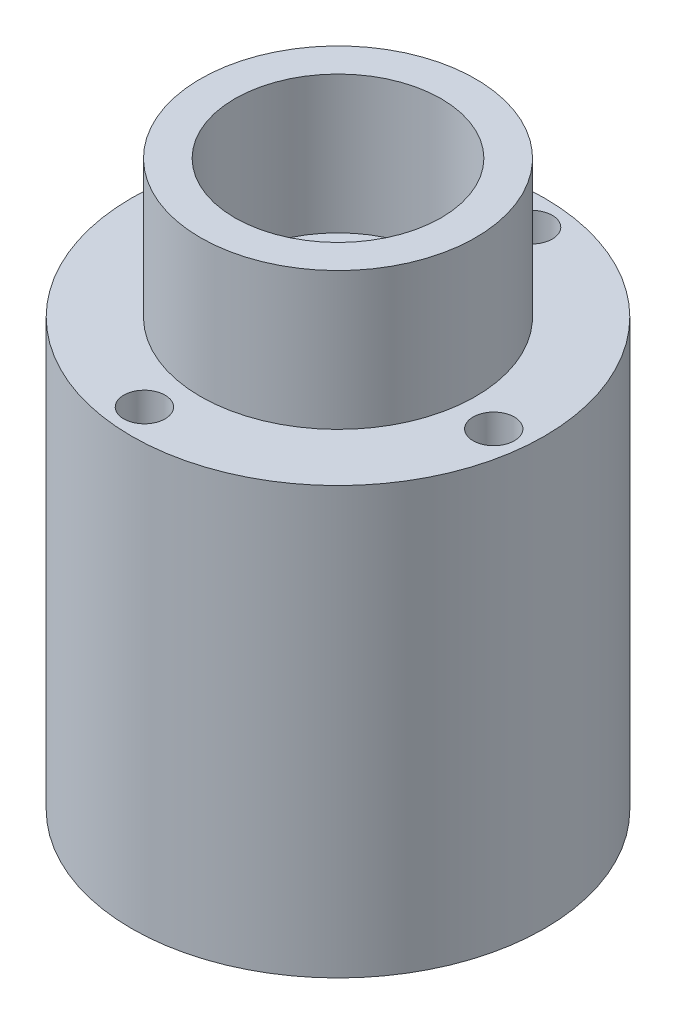
ISO-10303-21;
HEADER;
FILE_DESCRIPTION(('STEP AP214'),'2;1');
FILE_NAME('part.step','',(''),(''),'','','');
FILE_SCHEMA(('AUTOMOTIVE_DESIGN { 1 0 10303 214 1 1 1 1 }'));
ENDSEC;
DATA;
#1=APPLICATION_CONTEXT('core data for automotive mechanical design processes');
#2=APPLICATION_PROTOCOL_DEFINITION('international standard','automotive_design',2000,#1);
#3=PRODUCT_CONTEXT('',#1,'mechanical');
#4=PRODUCT('Part','Part','',(#3));
#5=PRODUCT_RELATED_PRODUCT_CATEGORY('part','',(#4));
#6=PRODUCT_DEFINITION_FORMATION('','',#4);
#7=PRODUCT_DEFINITION_CONTEXT('part definition',#1,'design');
#8=PRODUCT_DEFINITION('design','',#6,#7);
#9=PRODUCT_DEFINITION_SHAPE('','',#8);
#10=(LENGTH_UNIT() NAMED_UNIT(*) SI_UNIT(.MILLI.,.METRE.));
#11=(NAMED_UNIT(*) PLANE_ANGLE_UNIT() SI_UNIT($,.RADIAN.));
#12=(NAMED_UNIT(*) SI_UNIT($,.STERADIAN.) SOLID_ANGLE_UNIT());
#13=UNCERTAINTY_MEASURE_WITH_UNIT(LENGTH_MEASURE(1.E-05),#10,'distance_accuracy_value','');
#14=(GEOMETRIC_REPRESENTATION_CONTEXT(3) GLOBAL_UNCERTAINTY_ASSIGNED_CONTEXT((#13)) GLOBAL_UNIT_ASSIGNED_CONTEXT((#10,
#11,#12)) REPRESENTATION_CONTEXT('',''));
#15=CARTESIAN_POINT('',(0.,0.,0.));
#16=DIRECTION('',(0.,0.,1.));
#17=DIRECTION('',(1.,0.,0.));
#18=AXIS2_PLACEMENT_3D('',#15,#16,#17);
#19=CARTESIAN_POINT('',(0.,31.,0.));
#20=DIRECTION('',(0.,1.,0.));
#21=DIRECTION('',(0.,0.,1.));
#22=AXIS2_PLACEMENT_3D('',#19,#20,#21);
#23=PLANE('',#22);
#24=CARTESIAN_POINT('',(0.,31.,0.));
#25=DIRECTION('',(0.,1.,0.));
#26=DIRECTION('',(0.,0.,1.));
#27=AXIS2_PLACEMENT_3D('',#24,#25,#26);
#28=CIRCLE('',#27,10.);
#29=CARTESIAN_POINT('',(0.,31.,10.));
#30=VERTEX_POINT('',#29);
#31=EDGE_CURVE('E73',#30,#30,#28,.T.);
#32=ORIENTED_EDGE('',*,*,#31,.F.);
#33=EDGE_LOOP('',(#32));
#34=FACE_BOUND('',#33,.T.);
#35=CARTESIAN_POINT('',(12.6976915749806,31.,1.37718271530229));
#36=DIRECTION('',(0.,1.,0.));
#37=DIRECTION('',(0.,0.,1.));
#38=AXIS2_PLACEMENT_3D('',#35,#36,#37);
#39=CIRCLE('',#38,1.5);
#40=CARTESIAN_POINT('',(12.6976915749806,31.,2.87718271530229));
#41=VERTEX_POINT('',#40);
#42=EDGE_CURVE('E58',#41,#41,#39,.T.);
#43=ORIENTED_EDGE('',*,*,#42,.F.);
#44=EDGE_LOOP('',(#43));
#45=FACE_BOUND('',#44,.T.);
#46=CARTESIAN_POINT('',(-12.6976915749806,31.,-1.37718271530229));
#47=DIRECTION('',(0.,1.,0.));
#48=DIRECTION('',(0.,0.,1.));
#49=AXIS2_PLACEMENT_3D('',#46,#47,#48);
#50=CIRCLE('',#49,1.5);
#51=CARTESIAN_POINT('',(-12.6976915749806,31.,0.122817284697706));
#52=VERTEX_POINT('',#51);
#53=EDGE_CURVE('E47',#52,#52,#50,.T.);
#54=ORIENTED_EDGE('',*,*,#53,.F.);
#55=EDGE_LOOP('',(#54));
#56=FACE_BOUND('',#55,.T.);
#57=CARTESIAN_POINT('',(0.,31.,0.));
#58=DIRECTION('',(0.,1.,0.));
#59=DIRECTION('',(0.,0.,1.));
#60=AXIS2_PLACEMENT_3D('',#57,#58,#59);
#61=CIRCLE('',#60,15.);
#62=CARTESIAN_POINT('',(0.,31.,15.));
#63=VERTEX_POINT('',#62);
#64=EDGE_CURVE('E38',#63,#63,#61,.T.);
#65=ORIENTED_EDGE('',*,*,#64,.T.);
#66=EDGE_LOOP('',(#65));
#67=FACE_BOUND('',#66,.T.);
#68=CARTESIAN_POINT('',(1.37718271530229,31.,-12.6976915749806));
#69=DIRECTION('',(0.,1.,0.));
#70=DIRECTION('',(0.,0.,1.));
#71=AXIS2_PLACEMENT_3D('',#68,#69,#70);
#72=CIRCLE('',#71,1.5);
#73=CARTESIAN_POINT('',(1.37718271530229,31.,-11.1976915749806));
#74=VERTEX_POINT('',#73);
#75=EDGE_CURVE('E52',#74,#74,#72,.T.);
#76=ORIENTED_EDGE('',*,*,#75,.F.);
#77=EDGE_LOOP('',(#76));
#78=FACE_BOUND('',#77,.T.);
#79=CARTESIAN_POINT('',(-1.37718271530229,31.,12.6976915749806));
#80=DIRECTION('',(0.,1.,0.));
#81=DIRECTION('',(0.,0.,1.));
#82=AXIS2_PLACEMENT_3D('',#79,#80,#81);
#83=CIRCLE('',#82,1.5);
#84=CARTESIAN_POINT('',(-1.37718271530229,31.,14.1976915749806));
#85=VERTEX_POINT('',#84);
#86=EDGE_CURVE('E64',#85,#85,#83,.T.);
#87=ORIENTED_EDGE('',*,*,#86,.F.);
#88=EDGE_LOOP('',(#87));
#89=FACE_BOUND('',#88,.T.);
#90=ADVANCED_FACE('F31',(#34,#45,#56,#67,#78,#89),#23,.T.);
#91=CARTESIAN_POINT('',(0.,0.,0.));
#92=DIRECTION('',(0.,1.,0.));
#93=DIRECTION('',(0.,0.,1.));
#94=AXIS2_PLACEMENT_3D('',#91,#92,#93);
#95=PLANE('',#94);
#96=CARTESIAN_POINT('',(0.,0.,0.));
#97=DIRECTION('',(0.,1.,0.));
#98=DIRECTION('',(0.,0.,1.));
#99=AXIS2_PLACEMENT_3D('',#96,#97,#98);
#100=CIRCLE('',#99,15.);
#101=CARTESIAN_POINT('',(0.,0.,15.));
#102=VERTEX_POINT('',#101);
#103=EDGE_CURVE('E42',#102,#102,#100,.T.);
#104=ORIENTED_EDGE('',*,*,#103,.F.);
#105=EDGE_LOOP('',(#104));
#106=FACE_BOUND('',#105,.T.);
#107=CARTESIAN_POINT('',(-12.6976915749806,0.,-1.37718271530229));
#108=DIRECTION('',(0.,1.,0.));
#109=DIRECTION('',(0.,0.,1.));
#110=AXIS2_PLACEMENT_3D('',#107,#108,#109);
#111=CIRCLE('',#110,1.5);
#112=CARTESIAN_POINT('',(-12.6976915749806,0.,0.122817284697706));
#113=VERTEX_POINT('',#112);
#114=EDGE_CURVE('E49',#113,#113,#111,.T.);
#115=ORIENTED_EDGE('',*,*,#114,.T.);
#116=EDGE_LOOP('',(#115));
#117=FACE_BOUND('',#116,.T.);
#118=CARTESIAN_POINT('',(1.37718271530229,0.,-12.6976915749806));
#119=DIRECTION('',(0.,1.,0.));
#120=DIRECTION('',(0.,0.,1.));
#121=AXIS2_PLACEMENT_3D('',#118,#119,#120);
#122=CIRCLE('',#121,1.5);
#123=CARTESIAN_POINT('',(1.37718271530229,0.,-11.1976915749806));
#124=VERTEX_POINT('',#123);
#125=EDGE_CURVE('E55',#124,#124,#122,.T.);
#126=ORIENTED_EDGE('',*,*,#125,.T.);
#127=EDGE_LOOP('',(#126));
#128=FACE_BOUND('',#127,.T.);
#129=CARTESIAN_POINT('',(12.6976915749806,0.,1.37718271530229));
#130=DIRECTION('',(0.,1.,0.));
#131=DIRECTION('',(0.,0.,1.));
#132=AXIS2_PLACEMENT_3D('',#129,#130,#131);
#133=CIRCLE('',#132,1.5);
#134=CARTESIAN_POINT('',(12.6976915749806,0.,2.87718271530229));
#135=VERTEX_POINT('',#134);
#136=EDGE_CURVE('E61',#135,#135,#133,.T.);
#137=ORIENTED_EDGE('',*,*,#136,.T.);
#138=EDGE_LOOP('',(#137));
#139=FACE_BOUND('',#138,.T.);
#140=CARTESIAN_POINT('',(-1.37718271530229,0.,12.6976915749806));
#141=DIRECTION('',(0.,1.,0.));
#142=DIRECTION('',(0.,0.,1.));
#143=AXIS2_PLACEMENT_3D('',#140,#141,#142);
#144=CIRCLE('',#143,1.5);
#145=CARTESIAN_POINT('',(-1.37718271530229,0.,14.1976915749806));
#146=VERTEX_POINT('',#145);
#147=EDGE_CURVE('E67',#146,#146,#144,.T.);
#148=ORIENTED_EDGE('',*,*,#147,.T.);
#149=EDGE_LOOP('',(#148));
#150=FACE_BOUND('',#149,.T.);
#151=ADVANCED_FACE('F101',(#106,#117,#128,#139,#150),#95,.F.);
#152=CARTESIAN_POINT('',(0.,31.,0.));
#153=DIRECTION('',(0.,-1.,0.));
#154=DIRECTION('',(0.,0.,-1.));
#155=AXIS2_PLACEMENT_3D('',#152,#153,#154);
#156=CYLINDRICAL_SURFACE('',#155,15.);
#157=ORIENTED_EDGE('',*,*,#64,.F.);
#158=EDGE_LOOP('',(#157));
#159=FACE_BOUND('',#158,.T.);
#160=ORIENTED_EDGE('',*,*,#103,.T.);
#161=EDGE_LOOP('',(#160));
#162=FACE_BOUND('',#161,.T.);
#163=ADVANCED_FACE('F33',(#159,#162),#156,.T.);
#164=CARTESIAN_POINT('',(-12.6976915749806,31.,-1.37718271530229));
#165=DIRECTION('',(0.,-1.,0.));
#166=DIRECTION('',(0.,0.,-1.));
#167=AXIS2_PLACEMENT_3D('',#164,#165,#166);
#168=CYLINDRICAL_SURFACE('',#167,1.5);
#169=ORIENTED_EDGE('',*,*,#53,.T.);
#170=EDGE_LOOP('',(#169));
#171=FACE_BOUND('',#170,.T.);
#172=ORIENTED_EDGE('',*,*,#114,.F.);
#173=EDGE_LOOP('',(#172));
#174=FACE_BOUND('',#173,.T.);
#175=ADVANCED_FACE('F158',(#171,#174),#168,.F.);
#176=CARTESIAN_POINT('',(1.37718271530229,31.,-12.6976915749806));
#177=DIRECTION('',(0.,-1.,0.));
#178=DIRECTION('',(0.,0.,-1.));
#179=AXIS2_PLACEMENT_3D('',#176,#177,#178);
#180=CYLINDRICAL_SURFACE('',#179,1.5);
#181=ORIENTED_EDGE('',*,*,#75,.T.);
#182=EDGE_LOOP('',(#181));
#183=FACE_BOUND('',#182,.T.);
#184=ORIENTED_EDGE('',*,*,#125,.F.);
#185=EDGE_LOOP('',(#184));
#186=FACE_BOUND('',#185,.T.);
#187=ADVANCED_FACE('F148',(#183,#186),#180,.F.);
#188=CARTESIAN_POINT('',(12.6976915749806,31.,1.37718271530229));
#189=DIRECTION('',(0.,-1.,0.));
#190=DIRECTION('',(0.,0.,-1.));
#191=AXIS2_PLACEMENT_3D('',#188,#189,#190);
#192=CYLINDRICAL_SURFACE('',#191,1.5);
#193=ORIENTED_EDGE('',*,*,#42,.T.);
#194=EDGE_LOOP('',(#193));
#195=FACE_BOUND('',#194,.T.);
#196=ORIENTED_EDGE('',*,*,#136,.F.);
#197=EDGE_LOOP('',(#196));
#198=FACE_BOUND('',#197,.T.);
#199=ADVANCED_FACE('F96',(#195,#198),#192,.F.);
#200=CARTESIAN_POINT('',(-1.37718271530229,31.,12.6976915749806));
#201=DIRECTION('',(0.,-1.,0.));
#202=DIRECTION('',(0.,0.,-1.));
#203=AXIS2_PLACEMENT_3D('',#200,#201,#202);
#204=CYLINDRICAL_SURFACE('',#203,1.5);
#205=ORIENTED_EDGE('',*,*,#86,.T.);
#206=EDGE_LOOP('',(#205));
#207=FACE_BOUND('',#206,.T.);
#208=ORIENTED_EDGE('',*,*,#147,.F.);
#209=EDGE_LOOP('',(#208));
#210=FACE_BOUND('',#209,.T.);
#211=ADVANCED_FACE('F87',(#207,#210),#204,.F.);
#212=CARTESIAN_POINT('',(0.,41.,0.));
#213=DIRECTION('',(0.,1.,0.));
#214=DIRECTION('',(0.,0.,1.));
#215=AXIS2_PLACEMENT_3D('',#212,#213,#214);
#216=PLANE('',#215);
#217=CARTESIAN_POINT('',(0.,41.,0.));
#218=DIRECTION('',(0.,1.,0.));
#219=DIRECTION('',(0.,0.,1.));
#220=AXIS2_PLACEMENT_3D('',#217,#218,#219);
#221=CIRCLE('',#220,10.);
#222=CARTESIAN_POINT('',(0.,41.,10.));
#223=VERTEX_POINT('',#222);
#224=EDGE_CURVE('E70',#223,#223,#221,.T.);
#225=ORIENTED_EDGE('',*,*,#224,.T.);
#226=EDGE_LOOP('',(#225));
#227=FACE_BOUND('',#226,.T.);
#228=CARTESIAN_POINT('',(0.,41.,0.));
#229=DIRECTION('',(0.,1.,0.));
#230=DIRECTION('',(0.,0.,1.));
#231=AXIS2_PLACEMENT_3D('',#228,#229,#230);
#232=CIRCLE('',#231,7.5);
#233=CARTESIAN_POINT('',(0.,41.,7.5));
#234=VERTEX_POINT('',#233);
#235=EDGE_CURVE('E76',#234,#234,#232,.T.);
#236=ORIENTED_EDGE('',*,*,#235,.F.);
#237=EDGE_LOOP('',(#236));
#238=FACE_BOUND('',#237,.T.);
#239=ADVANCED_FACE('F84',(#227,#238),#216,.T.);
#240=CARTESIAN_POINT('',(0.,41.,0.));
#241=DIRECTION('',(0.,-1.,0.));
#242=DIRECTION('',(0.,0.,-1.));
#243=AXIS2_PLACEMENT_3D('',#240,#241,#242);
#244=CYLINDRICAL_SURFACE('',#243,10.);
#245=ORIENTED_EDGE('',*,*,#224,.F.);
#246=EDGE_LOOP('',(#245));
#247=FACE_BOUND('',#246,.T.);
#248=ORIENTED_EDGE('',*,*,#31,.T.);
#249=EDGE_LOOP('',(#248));
#250=FACE_BOUND('',#249,.T.);
#251=ADVANCED_FACE('F86',(#247,#250),#244,.T.);
#252=CARTESIAN_POINT('',(0.,41.,0.));
#253=DIRECTION('',(0.,-1.,0.));
#254=DIRECTION('',(0.,0.,-1.));
#255=AXIS2_PLACEMENT_3D('',#252,#253,#254);
#256=CYLINDRICAL_SURFACE('',#255,7.5);
#257=ORIENTED_EDGE('',*,*,#235,.T.);
#258=EDGE_LOOP('',(#257));
#259=FACE_BOUND('',#258,.T.);
#260=CARTESIAN_POINT('',(0.,31.,0.));
#261=DIRECTION('',(0.,1.,0.));
#262=DIRECTION('',(0.,0.,1.));
#263=AXIS2_PLACEMENT_3D('',#260,#261,#262);
#264=CIRCLE('',#263,7.5);
#265=CARTESIAN_POINT('',(0.,31.,7.5));
#266=VERTEX_POINT('',#265);
#267=EDGE_CURVE('E10',#266,#266,#264,.F.);
#268=ORIENTED_EDGE('',*,*,#267,.T.);
#269=EDGE_LOOP('',(#268));
#270=FACE_BOUND('',#269,.T.);
#271=ADVANCED_FACE('F82',(#259,#270),#256,.F.);
#272=ORIENTED_EDGE('',*,*,#267,.F.);
#273=EDGE_LOOP('',(#272));
#274=FACE_BOUND('',#273,.T.);
#275=ADVANCED_FACE('F104',(#274),#23,.T.);
#276=CLOSED_SHELL('',(#90,#151,#163,#175,#187,#199,#211,#239,#251,#271,#275));
#277=MANIFOLD_SOLID_BREP('B2',#276);
#278=ADVANCED_BREP_SHAPE_REPRESENTATION('',(#18,#277),#14);
#279=SHAPE_DEFINITION_REPRESENTATION(#9,#278);
ENDSEC;
END-ISO-10303-21;
